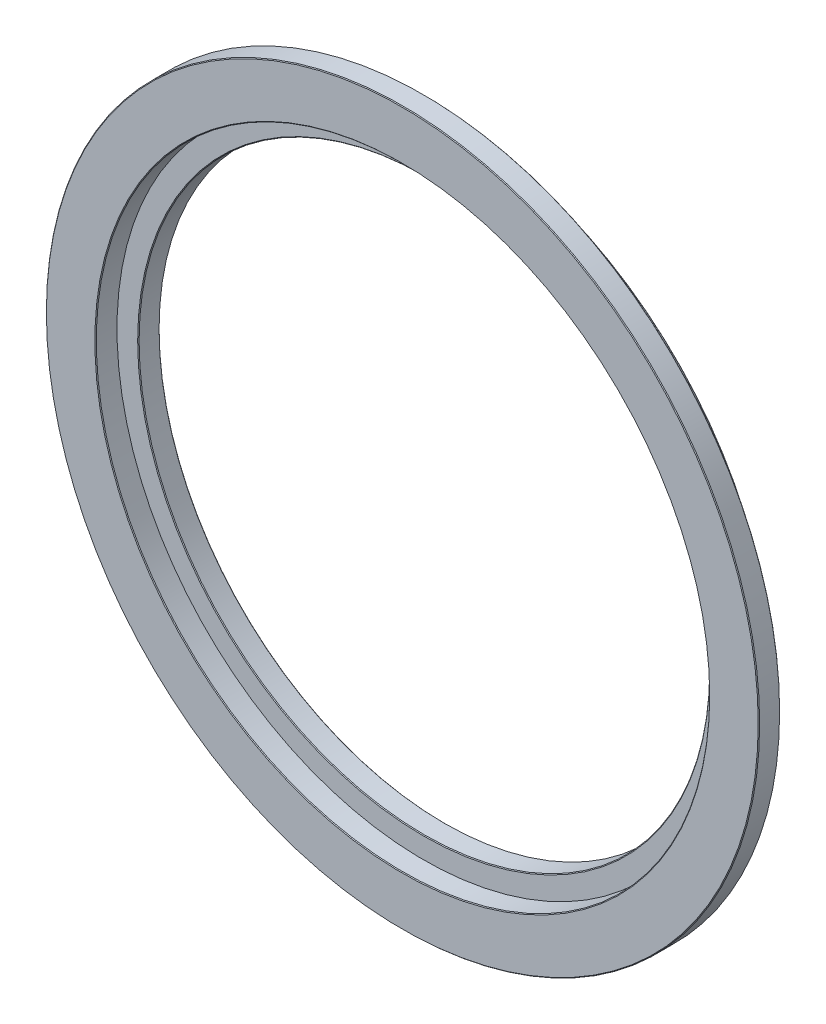
ISO-10303-21;
HEADER;
FILE_DESCRIPTION(('STEP AP214'),'2;1');
FILE_NAME('part.step','',(''),(''),'','','');
FILE_SCHEMA(('AUTOMOTIVE_DESIGN { 1 0 10303 214 1 1 1 1 }'));
ENDSEC;
DATA;
#1=APPLICATION_CONTEXT('core data for automotive mechanical design processes');
#2=APPLICATION_PROTOCOL_DEFINITION('international standard','automotive_design',2000,#1);
#3=PRODUCT_CONTEXT('',#1,'mechanical');
#4=PRODUCT('Part','Part','',(#3));
#5=PRODUCT_RELATED_PRODUCT_CATEGORY('part','',(#4));
#6=PRODUCT_DEFINITION_FORMATION('','',#4);
#7=PRODUCT_DEFINITION_CONTEXT('part definition',#1,'design');
#8=PRODUCT_DEFINITION('design','',#6,#7);
#9=PRODUCT_DEFINITION_SHAPE('','',#8);
#10=(LENGTH_UNIT() NAMED_UNIT(*) SI_UNIT(.MILLI.,.METRE.));
#11=(NAMED_UNIT(*) PLANE_ANGLE_UNIT() SI_UNIT($,.RADIAN.));
#12=(NAMED_UNIT(*) SI_UNIT($,.STERADIAN.) SOLID_ANGLE_UNIT());
#13=UNCERTAINTY_MEASURE_WITH_UNIT(LENGTH_MEASURE(1.E-05),#10,'distance_accuracy_value','');
#14=(GEOMETRIC_REPRESENTATION_CONTEXT(3) GLOBAL_UNCERTAINTY_ASSIGNED_CONTEXT((#13)) GLOBAL_UNIT_ASSIGNED_CONTEXT((#10,
#11,#12)) REPRESENTATION_CONTEXT('',''));
#15=CARTESIAN_POINT('',(0.,0.,0.));
#16=DIRECTION('',(0.,0.,1.));
#17=DIRECTION('',(1.,0.,0.));
#18=AXIS2_PLACEMENT_3D('',#15,#16,#17);
#19=CARTESIAN_POINT('',(0.,0.,60.8320493066256));
#20=DIRECTION('',(0.,0.,1.));
#21=DIRECTION('',(1.,0.,0.));
#22=AXIS2_PLACEMENT_3D('',#19,#20,#21);
#23=CYLINDRICAL_SURFACE('',#22,43.);
#24=CARTESIAN_POINT('',(0.,0.,3.));
#25=DIRECTION('',(0.,0.,1.));
#26=DIRECTION('',(1.,0.,0.));
#27=AXIS2_PLACEMENT_3D('',#24,#25,#26);
#28=CIRCLE('',#27,43.);
#29=CARTESIAN_POINT('',(43.,0.,3.));
#30=VERTEX_POINT('',#29);
#31=EDGE_CURVE('E100',#30,#30,#28,.T.);
#32=ORIENTED_EDGE('',*,*,#31,.F.);
#33=EDGE_LOOP('',(#32));
#34=FACE_BOUND('',#33,.T.);
#35=CARTESIAN_POINT('',(0.,0.,5.9));
#36=DIRECTION('',(0.,0.,1.));
#37=DIRECTION('',(1.,0.,0.));
#38=AXIS2_PLACEMENT_3D('',#35,#36,#37);
#39=CIRCLE('',#38,43.);
#40=CARTESIAN_POINT('',(43.,0.,5.9));
#41=VERTEX_POINT('',#40);
#42=EDGE_CURVE('E10',#41,#41,#39,.T.);
#43=ORIENTED_EDGE('',*,*,#42,.T.);
#44=EDGE_LOOP('',(#43));
#45=FACE_BOUND('',#44,.T.);
#46=ADVANCED_FACE('F41',(#34,#45),#23,.F.);
#47=CARTESIAN_POINT('',(0.,0.,6.));
#48=DIRECTION('',(0.,0.,1.));
#49=DIRECTION('',(1.,0.,0.));
#50=AXIS2_PLACEMENT_3D('',#47,#48,#49);
#51=CONICAL_SURFACE('',#50,43.1,0.785398163397483);
#52=ORIENTED_EDGE('',*,*,#42,.F.);
#53=EDGE_LOOP('',(#52));
#54=FACE_BOUND('',#53,.T.);
#55=CARTESIAN_POINT('',(0.,0.,6.));
#56=DIRECTION('',(0.,0.,1.));
#57=DIRECTION('',(1.,0.,0.));
#58=AXIS2_PLACEMENT_3D('',#55,#56,#57);
#59=CIRCLE('',#58,43.1);
#60=CARTESIAN_POINT('',(43.1,0.,6.));
#61=VERTEX_POINT('',#60);
#62=EDGE_CURVE('E48',#61,#61,#59,.T.);
#63=ORIENTED_EDGE('',*,*,#62,.T.);
#64=EDGE_LOOP('',(#63));
#65=FACE_BOUND('',#64,.T.);
#66=ADVANCED_FACE('F108',(#54,#65),#51,.F.);
#67=CARTESIAN_POINT('',(0.,43.1,6.));
#68=DIRECTION('',(0.,0.,-1.));
#69=DIRECTION('',(-1.,0.,0.));
#70=AXIS2_PLACEMENT_3D('',#67,#68,#69);
#71=PLANE('',#70);
#72=ORIENTED_EDGE('',*,*,#62,.F.);
#73=EDGE_LOOP('',(#72));
#74=FACE_BOUND('',#73,.T.);
#75=CARTESIAN_POINT('',(0.,0.,6.));
#76=DIRECTION('',(0.,0.,1.));
#77=DIRECTION('',(1.,0.,0.));
#78=AXIS2_PLACEMENT_3D('',#75,#76,#77);
#79=CIRCLE('',#78,49.9);
#80=CARTESIAN_POINT('',(49.9,0.,6.));
#81=VERTEX_POINT('',#80);
#82=EDGE_CURVE('E53',#81,#81,#79,.T.);
#83=ORIENTED_EDGE('',*,*,#82,.T.);
#84=EDGE_LOOP('',(#83));
#85=FACE_BOUND('',#84,.T.);
#86=ADVANCED_FACE('F112',(#74,#85),#71,.F.);
#87=CARTESIAN_POINT('',(0.,0.,5.9));
#88=DIRECTION('',(0.,0.,-1.));
#89=DIRECTION('',(-1.,0.,0.));
#90=AXIS2_PLACEMENT_3D('',#87,#88,#89);
#91=CONICAL_SURFACE('',#90,50.,0.785398163397483);
#92=ORIENTED_EDGE('',*,*,#82,.F.);
#93=EDGE_LOOP('',(#92));
#94=FACE_BOUND('',#93,.T.);
#95=CARTESIAN_POINT('',(0.,0.,5.9));
#96=DIRECTION('',(0.,0.,1.));
#97=DIRECTION('',(1.,0.,0.));
#98=AXIS2_PLACEMENT_3D('',#95,#96,#97);
#99=CIRCLE('',#98,50.);
#100=CARTESIAN_POINT('',(50.,0.,5.9));
#101=VERTEX_POINT('',#100);
#102=EDGE_CURVE('E58',#101,#101,#99,.T.);
#103=ORIENTED_EDGE('',*,*,#102,.T.);
#104=EDGE_LOOP('',(#103));
#105=FACE_BOUND('',#104,.T.);
#106=ADVANCED_FACE('F117',(#94,#105),#91,.T.);
#107=CARTESIAN_POINT('',(0.,0.,60.8320493066256));
#108=DIRECTION('',(0.,0.,1.));
#109=DIRECTION('',(1.,0.,0.));
#110=AXIS2_PLACEMENT_3D('',#107,#108,#109);
#111=CYLINDRICAL_SURFACE('',#110,50.);
#112=ORIENTED_EDGE('',*,*,#102,.F.);
#113=EDGE_LOOP('',(#112));
#114=FACE_BOUND('',#113,.T.);
#115=CARTESIAN_POINT('',(0.,0.,3.1));
#116=DIRECTION('',(0.,0.,1.));
#117=DIRECTION('',(1.,0.,0.));
#118=AXIS2_PLACEMENT_3D('',#115,#116,#117);
#119=CIRCLE('',#118,50.);
#120=CARTESIAN_POINT('',(50.,0.,3.1));
#121=VERTEX_POINT('',#120);
#122=EDGE_CURVE('E64',#121,#121,#119,.T.);
#123=ORIENTED_EDGE('',*,*,#122,.T.);
#124=EDGE_LOOP('',(#123));
#125=FACE_BOUND('',#124,.T.);
#126=ADVANCED_FACE('F123',(#114,#125),#111,.T.);
#127=CARTESIAN_POINT('',(0.,0.,3.));
#128=DIRECTION('',(0.,0.,1.));
#129=DIRECTION('',(1.,0.,0.));
#130=AXIS2_PLACEMENT_3D('',#127,#128,#129);
#131=CONICAL_SURFACE('',#130,49.9,0.785398163397483);
#132=ORIENTED_EDGE('',*,*,#122,.F.);
#133=EDGE_LOOP('',(#132));
#134=FACE_BOUND('',#133,.T.);
#135=CARTESIAN_POINT('',(0.,0.,3.));
#136=DIRECTION('',(0.,0.,1.));
#137=DIRECTION('',(1.,0.,0.));
#138=AXIS2_PLACEMENT_3D('',#135,#136,#137);
#139=CIRCLE('',#138,49.9);
#140=CARTESIAN_POINT('',(49.9,0.,3.));
#141=VERTEX_POINT('',#140);
#142=EDGE_CURVE('E68',#141,#141,#139,.T.);
#143=ORIENTED_EDGE('',*,*,#142,.T.);
#144=EDGE_LOOP('',(#143));
#145=FACE_BOUND('',#144,.T.);
#146=ADVANCED_FACE('F127',(#134,#145),#131,.T.);
#147=CARTESIAN_POINT('',(0.,49.9,3.));
#148=DIRECTION('',(0.,0.,1.));
#149=DIRECTION('',(1.,0.,0.));
#150=AXIS2_PLACEMENT_3D('',#147,#148,#149);
#151=PLANE('',#150);
#152=ORIENTED_EDGE('',*,*,#142,.F.);
#153=EDGE_LOOP('',(#152));
#154=FACE_BOUND('',#153,.T.);
#155=CARTESIAN_POINT('',(0.,0.,3.));
#156=DIRECTION('',(0.,0.,1.));
#157=DIRECTION('',(1.,0.,0.));
#158=AXIS2_PLACEMENT_3D('',#155,#156,#157);
#159=CIRCLE('',#158,46.);
#160=CARTESIAN_POINT('',(46.,0.,3.));
#161=VERTEX_POINT('',#160);
#162=EDGE_CURVE('E72',#161,#161,#159,.T.);
#163=ORIENTED_EDGE('',*,*,#162,.T.);
#164=EDGE_LOOP('',(#163));
#165=FACE_BOUND('',#164,.T.);
#166=ADVANCED_FACE('F131',(#154,#165),#151,.F.);
#167=CARTESIAN_POINT('',(0.,0.,60.8320493066256));
#168=DIRECTION('',(0.,0.,1.));
#169=DIRECTION('',(1.,0.,0.));
#170=AXIS2_PLACEMENT_3D('',#167,#168,#169);
#171=CYLINDRICAL_SURFACE('',#170,46.);
#172=ORIENTED_EDGE('',*,*,#162,.F.);
#173=EDGE_LOOP('',(#172));
#174=FACE_BOUND('',#173,.T.);
#175=CARTESIAN_POINT('',(0.,0.,0.100000000000003));
#176=DIRECTION('',(0.,0.,1.));
#177=DIRECTION('',(1.,0.,0.));
#178=AXIS2_PLACEMENT_3D('',#175,#176,#177);
#179=CIRCLE('',#178,46.);
#180=CARTESIAN_POINT('',(46.,0.,0.100000000000003));
#181=VERTEX_POINT('',#180);
#182=EDGE_CURVE('E76',#181,#181,#179,.T.);
#183=ORIENTED_EDGE('',*,*,#182,.T.);
#184=EDGE_LOOP('',(#183));
#185=FACE_BOUND('',#184,.T.);
#186=ADVANCED_FACE('F135',(#174,#185),#171,.T.);
#187=CARTESIAN_POINT('',(0.,0.,0.));
#188=DIRECTION('',(0.,0.,1.));
#189=DIRECTION('',(1.,0.,0.));
#190=AXIS2_PLACEMENT_3D('',#187,#188,#189);
#191=CONICAL_SURFACE('',#190,45.9,0.785398163397448);
#192=ORIENTED_EDGE('',*,*,#182,.F.);
#193=EDGE_LOOP('',(#192));
#194=FACE_BOUND('',#193,.T.);
#195=CARTESIAN_POINT('',(0.,0.,0.));
#196=DIRECTION('',(0.,0.,1.));
#197=DIRECTION('',(1.,0.,0.));
#198=AXIS2_PLACEMENT_3D('',#195,#196,#197);
#199=CIRCLE('',#198,45.9);
#200=CARTESIAN_POINT('',(45.9,0.,0.));
#201=VERTEX_POINT('',#200);
#202=EDGE_CURVE('E80',#201,#201,#199,.T.);
#203=ORIENTED_EDGE('',*,*,#202,.T.);
#204=EDGE_LOOP('',(#203));
#205=FACE_BOUND('',#204,.T.);
#206=ADVANCED_FACE('F139',(#194,#205),#191,.T.);
#207=CARTESIAN_POINT('',(0.,45.9,0.));
#208=DIRECTION('',(0.,0.,1.));
#209=DIRECTION('',(1.,0.,0.));
#210=AXIS2_PLACEMENT_3D('',#207,#208,#209);
#211=PLANE('',#210);
#212=ORIENTED_EDGE('',*,*,#202,.F.);
#213=EDGE_LOOP('',(#212));
#214=FACE_BOUND('',#213,.T.);
#215=CARTESIAN_POINT('',(0.,0.,0.));
#216=DIRECTION('',(0.,0.,1.));
#217=DIRECTION('',(1.,0.,0.));
#218=AXIS2_PLACEMENT_3D('',#215,#216,#217);
#219=CIRCLE('',#218,40.1);
#220=CARTESIAN_POINT('',(40.1,0.,0.));
#221=VERTEX_POINT('',#220);
#222=EDGE_CURVE('E84',#221,#221,#219,.T.);
#223=ORIENTED_EDGE('',*,*,#222,.T.);
#224=EDGE_LOOP('',(#223));
#225=FACE_BOUND('',#224,.T.);
#226=ADVANCED_FACE('F143',(#214,#225),#211,.F.);
#227=CARTESIAN_POINT('',(0.,0.,0.100000000000003));
#228=DIRECTION('',(0.,0.,-1.));
#229=DIRECTION('',(-1.,0.,0.));
#230=AXIS2_PLACEMENT_3D('',#227,#228,#229);
#231=CONICAL_SURFACE('',#230,40.,0.785398163397448);
#232=ORIENTED_EDGE('',*,*,#222,.F.);
#233=EDGE_LOOP('',(#232));
#234=FACE_BOUND('',#233,.T.);
#235=CARTESIAN_POINT('',(0.,0.,0.100000000000003));
#236=DIRECTION('',(0.,0.,1.));
#237=DIRECTION('',(1.,0.,0.));
#238=AXIS2_PLACEMENT_3D('',#235,#236,#237);
#239=CIRCLE('',#238,40.);
#240=CARTESIAN_POINT('',(40.,0.,0.100000000000003));
#241=VERTEX_POINT('',#240);
#242=EDGE_CURVE('E88',#241,#241,#239,.T.);
#243=ORIENTED_EDGE('',*,*,#242,.T.);
#244=EDGE_LOOP('',(#243));
#245=FACE_BOUND('',#244,.T.);
#246=ADVANCED_FACE('F147',(#234,#245),#231,.F.);
#247=CARTESIAN_POINT('',(0.,0.,60.8320493066256));
#248=DIRECTION('',(0.,0.,1.));
#249=DIRECTION('',(1.,0.,0.));
#250=AXIS2_PLACEMENT_3D('',#247,#248,#249);
#251=CYLINDRICAL_SURFACE('',#250,40.);
#252=ORIENTED_EDGE('',*,*,#242,.F.);
#253=EDGE_LOOP('',(#252));
#254=FACE_BOUND('',#253,.T.);
#255=CARTESIAN_POINT('',(0.,0.,2.9));
#256=DIRECTION('',(0.,0.,1.));
#257=DIRECTION('',(1.,0.,0.));
#258=AXIS2_PLACEMENT_3D('',#255,#256,#257);
#259=CIRCLE('',#258,40.);
#260=CARTESIAN_POINT('',(40.,0.,2.9));
#261=VERTEX_POINT('',#260);
#262=EDGE_CURVE('E92',#261,#261,#259,.T.);
#263=ORIENTED_EDGE('',*,*,#262,.T.);
#264=EDGE_LOOP('',(#263));
#265=FACE_BOUND('',#264,.T.);
#266=ADVANCED_FACE('F151',(#254,#265),#251,.F.);
#267=CARTESIAN_POINT('',(0.,0.,3.));
#268=DIRECTION('',(0.,0.,1.));
#269=DIRECTION('',(1.,0.,0.));
#270=AXIS2_PLACEMENT_3D('',#267,#268,#269);
#271=CONICAL_SURFACE('',#270,40.1,0.785398163397483);
#272=ORIENTED_EDGE('',*,*,#262,.F.);
#273=EDGE_LOOP('',(#272));
#274=FACE_BOUND('',#273,.T.);
#275=CARTESIAN_POINT('',(0.,0.,3.));
#276=DIRECTION('',(0.,0.,1.));
#277=DIRECTION('',(1.,0.,0.));
#278=AXIS2_PLACEMENT_3D('',#275,#276,#277);
#279=CIRCLE('',#278,40.1);
#280=CARTESIAN_POINT('',(40.1,0.,3.));
#281=VERTEX_POINT('',#280);
#282=EDGE_CURVE('E96',#281,#281,#279,.T.);
#283=ORIENTED_EDGE('',*,*,#282,.T.);
#284=EDGE_LOOP('',(#283));
#285=FACE_BOUND('',#284,.T.);
#286=ADVANCED_FACE('F155',(#274,#285),#271,.F.);
#287=CARTESIAN_POINT('',(0.,40.1,3.));
#288=DIRECTION('',(0.,0.,-1.));
#289=DIRECTION('',(-1.,0.,0.));
#290=AXIS2_PLACEMENT_3D('',#287,#288,#289);
#291=PLANE('',#290);
#292=ORIENTED_EDGE('',*,*,#282,.F.);
#293=EDGE_LOOP('',(#292));
#294=FACE_BOUND('',#293,.T.);
#295=ORIENTED_EDGE('',*,*,#31,.T.);
#296=EDGE_LOOP('',(#295));
#297=FACE_BOUND('',#296,.T.);
#298=ADVANCED_FACE('F105',(#294,#297),#291,.F.);
#299=CLOSED_SHELL('',(#46,#66,#86,#106,#126,#146,#166,#186,#206,#226,#246,#266,#286,#298));
#300=MANIFOLD_SOLID_BREP('B2',#299);
#301=ADVANCED_BREP_SHAPE_REPRESENTATION('',(#18,#300),#14);
#302=SHAPE_DEFINITION_REPRESENTATION(#9,#301);
ENDSEC;
END-ISO-10303-21;
